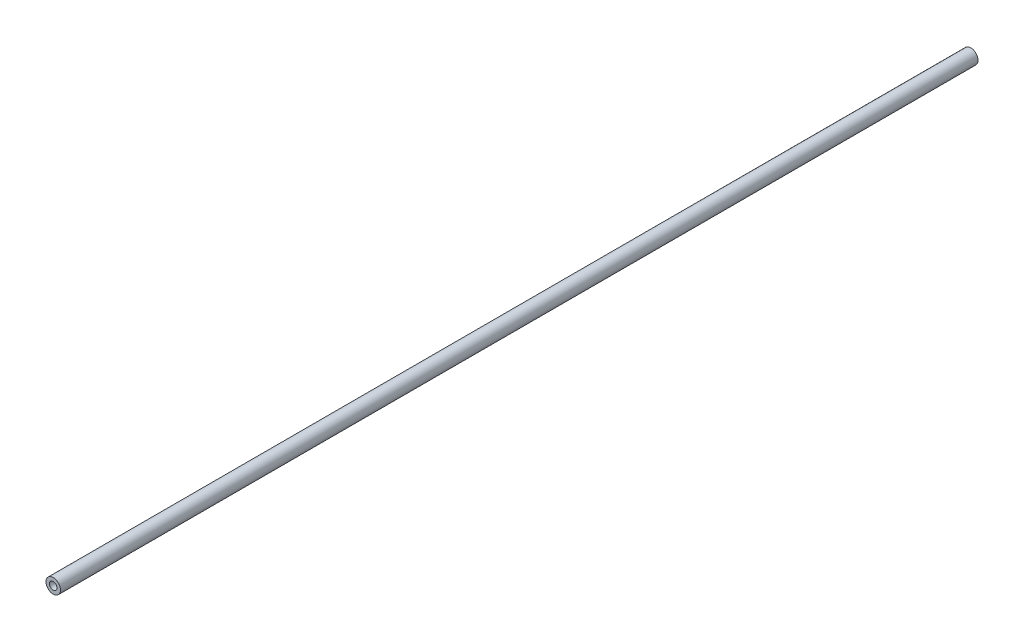
ISO-10303-21;
HEADER;
FILE_DESCRIPTION(('STEP AP214'),'2;1');
FILE_NAME('part.step','',(''),(''),'','','');
FILE_SCHEMA(('AUTOMOTIVE_DESIGN { 1 0 10303 214 1 1 1 1 }'));
ENDSEC;
DATA;
#1=APPLICATION_CONTEXT('core data for automotive mechanical design processes');
#2=APPLICATION_PROTOCOL_DEFINITION('international standard','automotive_design',2000,#1);
#3=PRODUCT_CONTEXT('',#1,'mechanical');
#4=PRODUCT('Part','Part','',(#3));
#5=PRODUCT_RELATED_PRODUCT_CATEGORY('part','',(#4));
#6=PRODUCT_DEFINITION_FORMATION('','',#4);
#7=PRODUCT_DEFINITION_CONTEXT('part definition',#1,'design');
#8=PRODUCT_DEFINITION('design','',#6,#7);
#9=PRODUCT_DEFINITION_SHAPE('','',#8);
#10=(LENGTH_UNIT() NAMED_UNIT(*) SI_UNIT(.MILLI.,.METRE.));
#11=(NAMED_UNIT(*) PLANE_ANGLE_UNIT() SI_UNIT($,.RADIAN.));
#12=(NAMED_UNIT(*) SI_UNIT($,.STERADIAN.) SOLID_ANGLE_UNIT());
#13=UNCERTAINTY_MEASURE_WITH_UNIT(LENGTH_MEASURE(1.E-05),#10,'distance_accuracy_value','');
#14=(GEOMETRIC_REPRESENTATION_CONTEXT(3) GLOBAL_UNCERTAINTY_ASSIGNED_CONTEXT((#13)) GLOBAL_UNIT_ASSIGNED_CONTEXT((#10,
#11,#12)) REPRESENTATION_CONTEXT('',''));
#15=CARTESIAN_POINT('',(0.,0.,0.));
#16=DIRECTION('',(0.,0.,1.));
#17=DIRECTION('',(1.,0.,0.));
#18=AXIS2_PLACEMENT_3D('',#15,#16,#17);
#19=CARTESIAN_POINT('',(0.,0.,302.18126));
#20=DIRECTION('',(0.,0.,1.));
#21=DIRECTION('',(1.,0.,0.));
#22=AXIS2_PLACEMENT_3D('',#19,#20,#21);
#23=PLANE('',#22);
#24=CARTESIAN_POINT('',(0.,0.,302.18126));
#25=DIRECTION('',(0.,0.,1.));
#26=DIRECTION('',(1.,0.,0.));
#27=AXIS2_PLACEMENT_3D('',#24,#25,#26);
#28=CIRCLE('',#27,4.7625);
#29=CARTESIAN_POINT('',(4.7625,0.,302.18126));
#30=VERTEX_POINT('',#29);
#31=EDGE_CURVE('E10',#30,#30,#28,.T.);
#32=ORIENTED_EDGE('',*,*,#31,.T.);
#33=EDGE_LOOP('',(#32));
#34=FACE_BOUND('',#33,.T.);
#35=CARTESIAN_POINT('',(0.,0.,302.18126));
#36=DIRECTION('',(0.,0.,1.));
#37=DIRECTION('',(1.,0.,0.));
#38=AXIS2_PLACEMENT_3D('',#35,#36,#37);
#39=CIRCLE('',#38,2.4892);
#40=CARTESIAN_POINT('',(2.4892,0.,302.18126));
#41=VERTEX_POINT('',#40);
#42=EDGE_CURVE('E54',#41,#41,#39,.T.);
#43=ORIENTED_EDGE('',*,*,#42,.F.);
#44=EDGE_LOOP('',(#43));
#45=FACE_BOUND('',#44,.T.);
#46=ADVANCED_FACE('F41',(#34,#45),#23,.T.);
#47=CARTESIAN_POINT('',(0.,0.,-302.18126));
#48=DIRECTION('',(0.,0.,1.));
#49=DIRECTION('',(1.,0.,0.));
#50=AXIS2_PLACEMENT_3D('',#47,#48,#49);
#51=PLANE('',#50);
#52=CARTESIAN_POINT('',(0.,0.,-302.18126));
#53=DIRECTION('',(0.,0.,1.));
#54=DIRECTION('',(1.,0.,0.));
#55=AXIS2_PLACEMENT_3D('',#52,#53,#54);
#56=CIRCLE('',#55,4.7625);
#57=CARTESIAN_POINT('',(4.7625,0.,-302.18126));
#58=VERTEX_POINT('',#57);
#59=EDGE_CURVE('E45',#58,#58,#56,.T.);
#60=ORIENTED_EDGE('',*,*,#59,.F.);
#61=EDGE_LOOP('',(#60));
#62=FACE_BOUND('',#61,.T.);
#63=CARTESIAN_POINT('',(0.,0.,-302.18126));
#64=DIRECTION('',(0.,0.,1.));
#65=DIRECTION('',(1.,0.,0.));
#66=AXIS2_PLACEMENT_3D('',#63,#64,#65);
#67=CIRCLE('',#66,2.4892);
#68=CARTESIAN_POINT('',(2.4892,0.,-302.18126));
#69=VERTEX_POINT('',#68);
#70=EDGE_CURVE('E56',#69,#69,#67,.T.);
#71=ORIENTED_EDGE('',*,*,#70,.T.);
#72=EDGE_LOOP('',(#71));
#73=FACE_BOUND('',#72,.T.);
#74=ADVANCED_FACE('F68',(#62,#73),#51,.F.);
#75=CARTESIAN_POINT('',(0.,0.,302.18126));
#76=DIRECTION('',(0.,0.,-1.));
#77=DIRECTION('',(-1.,0.,0.));
#78=AXIS2_PLACEMENT_3D('',#75,#76,#77);
#79=CYLINDRICAL_SURFACE('',#78,4.7625);
#80=ORIENTED_EDGE('',*,*,#31,.F.);
#81=EDGE_LOOP('',(#80));
#82=FACE_BOUND('',#81,.T.);
#83=ORIENTED_EDGE('',*,*,#59,.T.);
#84=EDGE_LOOP('',(#83));
#85=FACE_BOUND('',#84,.T.);
#86=ADVANCED_FACE('F43',(#82,#85),#79,.T.);
#87=CARTESIAN_POINT('',(0.,0.,302.18126));
#88=DIRECTION('',(0.,0.,-1.));
#89=DIRECTION('',(-1.,0.,0.));
#90=AXIS2_PLACEMENT_3D('',#87,#88,#89);
#91=CYLINDRICAL_SURFACE('',#90,2.4892);
#92=ORIENTED_EDGE('',*,*,#42,.T.);
#93=EDGE_LOOP('',(#92));
#94=FACE_BOUND('',#93,.T.);
#95=ORIENTED_EDGE('',*,*,#70,.F.);
#96=EDGE_LOOP('',(#95));
#97=FACE_BOUND('',#96,.T.);
#98=ADVANCED_FACE('F64',(#94,#97),#91,.F.);
#99=CLOSED_SHELL('',(#46,#74,#86,#98));
#100=MANIFOLD_SOLID_BREP('B2',#99);
#101=ADVANCED_BREP_SHAPE_REPRESENTATION('',(#18,#100),#14);
#102=SHAPE_DEFINITION_REPRESENTATION(#9,#101);
ENDSEC;
END-ISO-10303-21;
